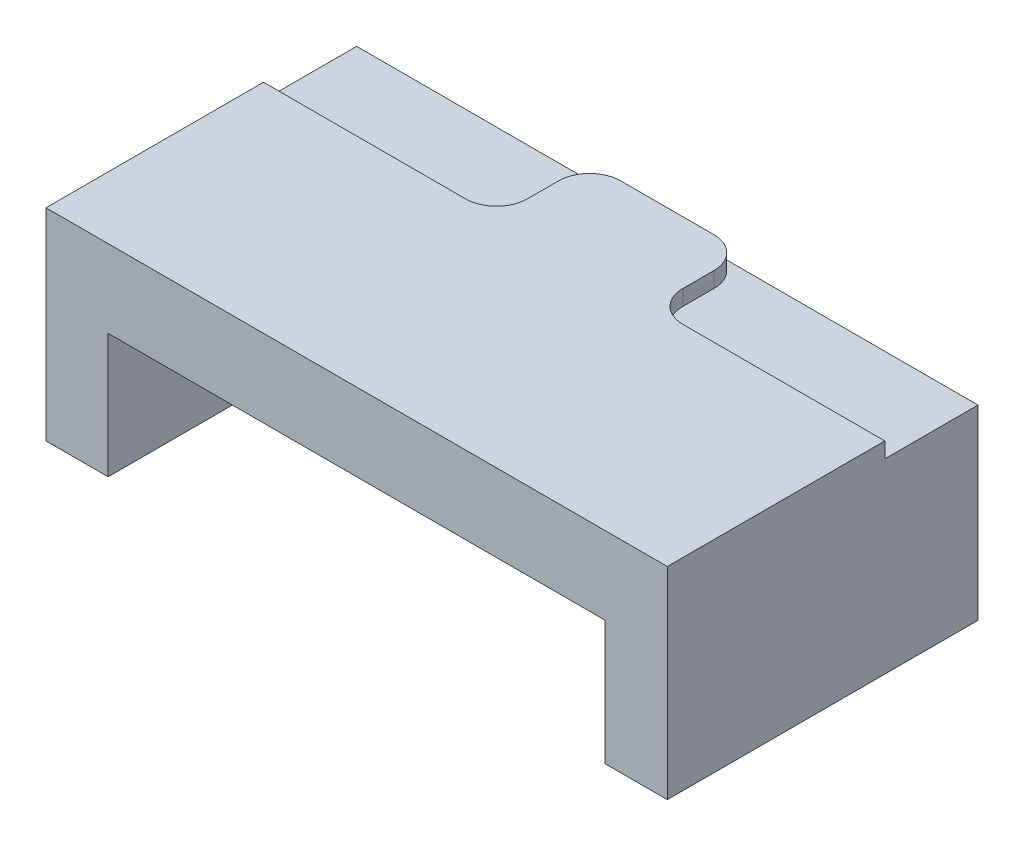
ISO-10303-21;
HEADER;
FILE_DESCRIPTION(('STEP AP214'),'2;1');
FILE_NAME('part.step','',(''),(''),'','','');
FILE_SCHEMA(('AUTOMOTIVE_DESIGN { 1 0 10303 214 1 1 1 1 }'));
ENDSEC;
DATA;
#1=APPLICATION_CONTEXT('core data for automotive mechanical design processes');
#2=APPLICATION_PROTOCOL_DEFINITION('international standard','automotive_design',2000,#1);
#3=PRODUCT_CONTEXT('',#1,'mechanical');
#4=PRODUCT('Part','Part','',(#3));
#5=PRODUCT_RELATED_PRODUCT_CATEGORY('part','',(#4));
#6=PRODUCT_DEFINITION_FORMATION('','',#4);
#7=PRODUCT_DEFINITION_CONTEXT('part definition',#1,'design');
#8=PRODUCT_DEFINITION('design','',#6,#7);
#9=PRODUCT_DEFINITION_SHAPE('','',#8);
#10=(LENGTH_UNIT() NAMED_UNIT(*) SI_UNIT(.MILLI.,.METRE.));
#11=(NAMED_UNIT(*) PLANE_ANGLE_UNIT() SI_UNIT($,.RADIAN.));
#12=(NAMED_UNIT(*) SI_UNIT($,.STERADIAN.) SOLID_ANGLE_UNIT());
#13=UNCERTAINTY_MEASURE_WITH_UNIT(LENGTH_MEASURE(1.E-05),#10,'distance_accuracy_value','');
#14=(GEOMETRIC_REPRESENTATION_CONTEXT(3) GLOBAL_UNCERTAINTY_ASSIGNED_CONTEXT((#13)) GLOBAL_UNIT_ASSIGNED_CONTEXT((#10,
#11,#12)) REPRESENTATION_CONTEXT('',''));
#15=CARTESIAN_POINT('',(0.,0.,0.));
#16=DIRECTION('',(0.,0.,1.));
#17=DIRECTION('',(1.,0.,0.));
#18=AXIS2_PLACEMENT_3D('',#15,#16,#17);
#19=CARTESIAN_POINT('',(0.,204.088235294118,538.804997387774));
#20=DIRECTION('',(0.,-1.,0.));
#21=DIRECTION('',(1.,0.,0.));
#22=AXIS2_PLACEMENT_3D('',#19,#20,#21);
#23=PLANE('',#22);
#24=DIRECTION('',(1.,0.,0.));
#25=VECTOR('',#24,1.);
#26=CARTESIAN_POINT('',(0.,204.088235294118,-161.195002612226));
#27=LINE('',#26,#25);
#28=CARTESIAN_POINT('',(-1000.,204.088235294118,-161.195002612226));
#29=VERTEX_POINT('',#28);
#30=CARTESIAN_POINT('',(-350.,204.088235294118,-161.195002612226));
#31=VERTEX_POINT('',#30);
#32=EDGE_CURVE('E186',#29,#31,#27,.T.);
#33=ORIENTED_EDGE('',*,*,#32,.T.);
#34=CARTESIAN_POINT('',(-350.,204.088235294118,-261.195002612226));
#35=DIRECTION('',(0.,-1.,0.));
#36=DIRECTION('',(1.,0.,0.));
#37=AXIS2_PLACEMENT_3D('',#34,#35,#36);
#38=CIRCLE('',#37,100.);
#39=CARTESIAN_POINT('',(-250.,204.088235294118,-261.195002612226));
#40=VERTEX_POINT('',#39);
#41=EDGE_CURVE('E328',#31,#40,#38,.F.);
#42=ORIENTED_EDGE('',*,*,#41,.T.);
#43=DIRECTION('',(0.,0.,1.));
#44=VECTOR('',#43,1.);
#45=CARTESIAN_POINT('',(-250.,204.088235294118,-461.195002612226));
#46=LINE('',#45,#44);
#47=CARTESIAN_POINT('',(-250.,204.088235294118,-361.195002612226));
#48=VERTEX_POINT('',#47);
#49=EDGE_CURVE('E210',#48,#40,#46,.T.);
#50=ORIENTED_EDGE('',*,*,#49,.F.);
#51=CARTESIAN_POINT('',(-150.,204.088235294118,-361.195002612226));
#52=DIRECTION('',(0.,-1.,0.));
#53=DIRECTION('',(1.,0.,0.));
#54=AXIS2_PLACEMENT_3D('',#51,#52,#53);
#55=CIRCLE('',#54,100.);
#56=CARTESIAN_POINT('',(-150.,204.088235294118,-461.195002612226));
#57=VERTEX_POINT('',#56);
#58=EDGE_CURVE('E364',#48,#57,#55,.T.);
#59=ORIENTED_EDGE('',*,*,#58,.T.);
#60=DIRECTION('',(-1.,0.,0.));
#61=VECTOR('',#60,1.);
#62=CARTESIAN_POINT('',(0.,204.088235294118,-461.195002612226));
#63=LINE('',#62,#61);
#64=CARTESIAN_POINT('',(-1000.,204.088235294117,-461.195002612226));
#65=VERTEX_POINT('',#64);
#66=EDGE_CURVE('E283',#57,#65,#63,.T.);
#67=ORIENTED_EDGE('',*,*,#66,.T.);
#68=DIRECTION('',(0.,0.,-1.));
#69=VECTOR('',#68,1.);
#70=CARTESIAN_POINT('',(-1000.,204.088235294117,538.804997387774));
#71=LINE('',#70,#69);
#72=EDGE_CURVE('E322',#29,#65,#71,.T.);
#73=ORIENTED_EDGE('',*,*,#72,.F.);
#74=EDGE_LOOP('',(#33,#42,#50,#59,#67,#73));
#75=FACE_BOUND('',#74,.T.);
#76=ADVANCED_FACE('F53',(#75),#23,.F.);
#77=DIRECTION('',(0.,0.,1.));
#78=VECTOR('',#77,1.);
#79=CARTESIAN_POINT('',(250.,204.088235294118,-461.195002612226));
#80=LINE('',#79,#78);
#81=CARTESIAN_POINT('',(250.,204.088235294118,-361.195002612226));
#82=VERTEX_POINT('',#81);
#83=CARTESIAN_POINT('',(250.,204.088235294118,-261.195002612226));
#84=VERTEX_POINT('',#83);
#85=EDGE_CURVE('E215',#82,#84,#80,.T.);
#86=ORIENTED_EDGE('',*,*,#85,.T.);
#87=CARTESIAN_POINT('',(350.,204.088235294118,-261.195002612226));
#88=DIRECTION('',(0.,-1.,0.));
#89=DIRECTION('',(1.,0.,0.));
#90=AXIS2_PLACEMENT_3D('',#87,#88,#89);
#91=CIRCLE('',#90,100.);
#92=CARTESIAN_POINT('',(350.,204.088235294118,-161.195002612226));
#93=VERTEX_POINT('',#92);
#94=EDGE_CURVE('E69',#84,#93,#91,.F.);
#95=ORIENTED_EDGE('',*,*,#94,.T.);
#96=CARTESIAN_POINT('',(1000.,204.088235294117,-161.195002612226));
#97=VERTEX_POINT('',#96);
#98=EDGE_CURVE('E242',#93,#97,#27,.T.);
#99=ORIENTED_EDGE('',*,*,#98,.T.);
#100=DIRECTION('',(0.,0.,-1.));
#101=VECTOR('',#100,1.);
#102=CARTESIAN_POINT('',(1000.,204.088235294117,538.804997387774));
#103=LINE('',#102,#101);
#104=CARTESIAN_POINT('',(1000.,204.088235294117,-461.195002612226));
#105=VERTEX_POINT('',#104);
#106=EDGE_CURVE('E260',#97,#105,#103,.T.);
#107=ORIENTED_EDGE('',*,*,#106,.T.);
#108=CARTESIAN_POINT('',(150.,204.088235294118,-461.195002612226));
#109=VERTEX_POINT('',#108);
#110=EDGE_CURVE('E297',#105,#109,#63,.T.);
#111=ORIENTED_EDGE('',*,*,#110,.T.);
#112=CARTESIAN_POINT('',(150.,204.088235294118,-361.195002612226));
#113=DIRECTION('',(0.,-1.,0.));
#114=DIRECTION('',(1.,0.,0.));
#115=AXIS2_PLACEMENT_3D('',#112,#113,#114);
#116=CIRCLE('',#115,100.);
#117=EDGE_CURVE('E62',#109,#82,#116,.T.);
#118=ORIENTED_EDGE('',*,*,#117,.T.);
#119=EDGE_LOOP('',(#86,#95,#99,#107,#111,#118));
#120=FACE_BOUND('',#119,.T.);
#121=ADVANCED_FACE('F370',(#120),#23,.F.);
#122=CARTESIAN_POINT('',(-1000.,204.088235294117,538.804997387774));
#123=DIRECTION('',(1.,0.,0.));
#124=DIRECTION('',(0.,1.,0.));
#125=AXIS2_PLACEMENT_3D('',#122,#123,#124);
#126=PLANE('',#125);
#127=DIRECTION('',(0.,-1.,0.));
#128=VECTOR('',#127,1.);
#129=CARTESIAN_POINT('',(-1000.,204.088235294117,-461.195002612226));
#130=LINE('',#129,#128);
#131=CARTESIAN_POINT('',(-1000.,-395.911764705882,-461.195002612226));
#132=VERTEX_POINT('',#131);
#133=EDGE_CURVE('E300',#65,#132,#130,.T.);
#134=ORIENTED_EDGE('',*,*,#133,.T.);
#135=DIRECTION('',(0.,0.,-1.));
#136=VECTOR('',#135,1.);
#137=CARTESIAN_POINT('',(-1000.,-395.911764705882,538.804997387774));
#138=LINE('',#137,#136);
#139=CARTESIAN_POINT('',(-1000.,-395.911764705882,538.804997387774));
#140=VERTEX_POINT('',#139);
#141=EDGE_CURVE('E318',#140,#132,#138,.T.);
#142=ORIENTED_EDGE('',*,*,#141,.F.);
#143=DIRECTION('',(0.,-1.,0.));
#144=VECTOR('',#143,1.);
#145=CARTESIAN_POINT('',(-1000.,204.088235294117,538.804997387774));
#146=LINE('',#145,#144);
#147=CARTESIAN_POINT('',(-1000.,254.088235294118,538.804997387774));
#148=VERTEX_POINT('',#147);
#149=EDGE_CURVE('E197',#148,#140,#146,.T.);
#150=ORIENTED_EDGE('',*,*,#149,.F.);
#151=DIRECTION('',(0.,0.,1.));
#152=VECTOR('',#151,1.);
#153=CARTESIAN_POINT('',(-1000.,254.088235294118,-461.195002612226));
#154=LINE('',#153,#152);
#155=CARTESIAN_POINT('',(-1000.,254.088235294118,-161.195002612226));
#156=VERTEX_POINT('',#155);
#157=EDGE_CURVE('E194',#156,#148,#154,.T.);
#158=ORIENTED_EDGE('',*,*,#157,.F.);
#159=DIRECTION('',(0.,-1.,0.));
#160=VECTOR('',#159,1.);
#161=CARTESIAN_POINT('',(-1000.,254.088235294118,-161.195002612226));
#162=LINE('',#161,#160);
#163=EDGE_CURVE('E178',#156,#29,#162,.T.);
#164=ORIENTED_EDGE('',*,*,#163,.T.);
#165=ORIENTED_EDGE('',*,*,#72,.T.);
#166=EDGE_LOOP('',(#134,#142,#150,#158,#164,#165));
#167=FACE_BOUND('',#166,.T.);
#168=ADVANCED_FACE('F195',(#167),#126,.F.);
#169=CARTESIAN_POINT('',(-1000.,-395.911764705882,538.804997387774));
#170=DIRECTION('',(0.,1.,0.));
#171=DIRECTION('',(-1.,0.,0.));
#172=AXIS2_PLACEMENT_3D('',#169,#170,#171);
#173=PLANE('',#172);
#174=DIRECTION('',(1.,0.,0.));
#175=VECTOR('',#174,1.);
#176=CARTESIAN_POINT('',(-1000.,-395.911764705882,-461.195002612226));
#177=LINE('',#176,#175);
#178=CARTESIAN_POINT('',(-800.,-395.911764705882,-461.195002612226));
#179=VERTEX_POINT('',#178);
#180=EDGE_CURVE('E303',#132,#179,#177,.T.);
#181=ORIENTED_EDGE('',*,*,#180,.T.);
#182=DIRECTION('',(0.,0.,-1.));
#183=VECTOR('',#182,1.);
#184=CARTESIAN_POINT('',(-800.,-395.911764705882,538.804997387774));
#185=LINE('',#184,#183);
#186=CARTESIAN_POINT('',(-800.,-395.911764705882,538.804997387774));
#187=VERTEX_POINT('',#186);
#188=EDGE_CURVE('E314',#187,#179,#185,.T.);
#189=ORIENTED_EDGE('',*,*,#188,.F.);
#190=DIRECTION('',(1.,0.,0.));
#191=VECTOR('',#190,1.);
#192=CARTESIAN_POINT('',(-1000.,-395.911764705882,538.804997387774));
#193=LINE('',#192,#191);
#194=EDGE_CURVE('E286',#140,#187,#193,.T.);
#195=ORIENTED_EDGE('',*,*,#194,.F.);
#196=ORIENTED_EDGE('',*,*,#141,.T.);
#197=EDGE_LOOP('',(#181,#189,#195,#196));
#198=FACE_BOUND('',#197,.T.);
#199=ADVANCED_FACE('F401',(#198),#173,.F.);
#200=CARTESIAN_POINT('',(-800.,-395.911764705882,538.804997387774));
#201=DIRECTION('',(-1.,0.,0.));
#202=DIRECTION('',(0.,0.,1.));
#203=AXIS2_PLACEMENT_3D('',#200,#201,#202);
#204=PLANE('',#203);
#205=DIRECTION('',(0.,1.,0.));
#206=VECTOR('',#205,1.);
#207=CARTESIAN_POINT('',(-800.,-395.911764705882,-461.195002612226));
#208=LINE('',#207,#206);
#209=CARTESIAN_POINT('',(-800.,4.08823529411739,-461.195002612226));
#210=VERTEX_POINT('',#209);
#211=EDGE_CURVE('E306',#179,#210,#208,.T.);
#212=ORIENTED_EDGE('',*,*,#211,.T.);
#213=DIRECTION('',(0.,0.,-1.));
#214=VECTOR('',#213,1.);
#215=CARTESIAN_POINT('',(-800.,4.08823529411739,538.804997387774));
#216=LINE('',#215,#214);
#217=CARTESIAN_POINT('',(-800.,4.08823529411739,538.804997387774));
#218=VERTEX_POINT('',#217);
#219=EDGE_CURVE('E296',#218,#210,#216,.T.);
#220=ORIENTED_EDGE('',*,*,#219,.F.);
#221=DIRECTION('',(0.,1.,0.));
#222=VECTOR('',#221,1.);
#223=CARTESIAN_POINT('',(-800.,-395.911764705882,538.804997387774));
#224=LINE('',#223,#222);
#225=EDGE_CURVE('E290',#187,#218,#224,.T.);
#226=ORIENTED_EDGE('',*,*,#225,.F.);
#227=ORIENTED_EDGE('',*,*,#188,.T.);
#228=EDGE_LOOP('',(#212,#220,#226,#227));
#229=FACE_BOUND('',#228,.T.);
#230=ADVANCED_FACE('F407',(#229),#204,.F.);
#231=CARTESIAN_POINT('',(-800.,4.08823529411739,538.804997387774));
#232=DIRECTION('',(0.,1.,0.));
#233=DIRECTION('',(0.,0.,1.));
#234=AXIS2_PLACEMENT_3D('',#231,#232,#233);
#235=PLANE('',#234);
#236=DIRECTION('',(1.,0.,0.));
#237=VECTOR('',#236,1.);
#238=CARTESIAN_POINT('',(-800.,4.08823529411739,-461.195002612226));
#239=LINE('',#238,#237);
#240=CARTESIAN_POINT('',(800.,4.08823529411739,-461.195002612226));
#241=VERTEX_POINT('',#240);
#242=EDGE_CURVE('E287',#210,#241,#239,.T.);
#243=ORIENTED_EDGE('',*,*,#242,.T.);
#244=DIRECTION('',(0.,0.,-1.));
#245=VECTOR('',#244,1.);
#246=CARTESIAN_POINT('',(800.,4.08823529411739,538.804997387774));
#247=LINE('',#246,#245);
#248=CARTESIAN_POINT('',(800.,4.08823529411739,538.804997387774));
#249=VERTEX_POINT('',#248);
#250=EDGE_CURVE('E279',#249,#241,#247,.T.);
#251=ORIENTED_EDGE('',*,*,#250,.F.);
#252=DIRECTION('',(1.,0.,0.));
#253=VECTOR('',#252,1.);
#254=CARTESIAN_POINT('',(-800.,4.08823529411739,538.804997387774));
#255=LINE('',#254,#253);
#256=EDGE_CURVE('E293',#218,#249,#255,.T.);
#257=ORIENTED_EDGE('',*,*,#256,.F.);
#258=ORIENTED_EDGE('',*,*,#219,.T.);
#259=EDGE_LOOP('',(#243,#251,#257,#258));
#260=FACE_BOUND('',#259,.T.);
#261=ADVANCED_FACE('F411',(#260),#235,.F.);
#262=CARTESIAN_POINT('',(0.,-395.911764705882,538.804997387774));
#263=DIRECTION('',(0.,0.,1.));
#264=DIRECTION('',(1.,0.,0.));
#265=AXIS2_PLACEMENT_3D('',#262,#263,#264);
#266=PLANE('',#265);
#267=ORIENTED_EDGE('',*,*,#256,.T.);
#268=DIRECTION('',(0.,1.,0.));
#269=VECTOR('',#268,1.);
#270=CARTESIAN_POINT('',(800.,-395.911764705882,538.804997387774));
#271=LINE('',#270,#269);
#272=CARTESIAN_POINT('',(800.,-395.911764705882,538.804997387774));
#273=VERTEX_POINT('',#272);
#274=EDGE_CURVE('E247',#273,#249,#271,.T.);
#275=ORIENTED_EDGE('',*,*,#274,.F.);
#276=DIRECTION('',(-1.,0.,0.));
#277=VECTOR('',#276,1.);
#278=CARTESIAN_POINT('',(1000.,-395.911764705882,538.804997387774));
#279=LINE('',#278,#277);
#280=CARTESIAN_POINT('',(1000.,-395.911764705882,538.804997387774));
#281=VERTEX_POINT('',#280);
#282=EDGE_CURVE('E251',#281,#273,#279,.T.);
#283=ORIENTED_EDGE('',*,*,#282,.F.);
#284=DIRECTION('',(0.,-1.,0.));
#285=VECTOR('',#284,1.);
#286=CARTESIAN_POINT('',(1000.,204.088235294117,538.804997387774));
#287=LINE('',#286,#285);
#288=CARTESIAN_POINT('',(1000.,254.088235294118,538.804997387774));
#289=VERTEX_POINT('',#288);
#290=EDGE_CURVE('E256',#289,#281,#287,.T.);
#291=ORIENTED_EDGE('',*,*,#290,.F.);
#292=DIRECTION('',(1.,0.,0.));
#293=VECTOR('',#292,1.);
#294=CARTESIAN_POINT('',(0.,254.088235294118,538.804997387774));
#295=LINE('',#294,#293);
#296=EDGE_CURVE('E202',#148,#289,#295,.T.);
#297=ORIENTED_EDGE('',*,*,#296,.F.);
#298=ORIENTED_EDGE('',*,*,#149,.T.);
#299=ORIENTED_EDGE('',*,*,#194,.T.);
#300=ORIENTED_EDGE('',*,*,#225,.T.);
#301=EDGE_LOOP('',(#267,#275,#283,#291,#297,#298,#299,#300));
#302=FACE_BOUND('',#301,.T.);
#303=ADVANCED_FACE('F415',(#302),#266,.T.);
#304=CARTESIAN_POINT('',(0.,-395.911764705882,-461.195002612226));
#305=DIRECTION('',(0.,0.,1.));
#306=DIRECTION('',(1.,0.,0.));
#307=AXIS2_PLACEMENT_3D('',#304,#305,#306);
#308=PLANE('',#307);
#309=ORIENTED_EDGE('',*,*,#66,.F.);
#310=DIRECTION('',(0.,-1.,0.));
#311=VECTOR('',#310,1.);
#312=CARTESIAN_POINT('',(-150.,-395.911764705882,-461.195002612226));
#313=LINE('',#312,#311);
#314=CARTESIAN_POINT('',(-150.,254.088235294118,-461.195002612226));
#315=VERTEX_POINT('',#314);
#316=EDGE_CURVE('E342',#57,#315,#313,.F.);
#317=ORIENTED_EDGE('',*,*,#316,.T.);
#318=DIRECTION('',(-1.,0.,0.));
#319=VECTOR('',#318,1.);
#320=CARTESIAN_POINT('',(0.,254.088235294118,-461.195002612226));
#321=LINE('',#320,#319);
#322=CARTESIAN_POINT('',(150.,254.088235294118,-461.195002612226));
#323=VERTEX_POINT('',#322);
#324=EDGE_CURVE('E227',#323,#315,#321,.T.);
#325=ORIENTED_EDGE('',*,*,#324,.F.);
#326=DIRECTION('',(0.,-1.,0.));
#327=VECTOR('',#326,1.);
#328=CARTESIAN_POINT('',(150.,204.088235294118,-461.195002612226));
#329=LINE('',#328,#327);
#330=EDGE_CURVE('E338',#323,#109,#329,.T.);
#331=ORIENTED_EDGE('',*,*,#330,.T.);
#332=ORIENTED_EDGE('',*,*,#110,.F.);
#333=DIRECTION('',(0.,-1.,0.));
#334=VECTOR('',#333,1.);
#335=CARTESIAN_POINT('',(1000.,204.088235294117,-461.195002612226));
#336=LINE('',#335,#334);
#337=CARTESIAN_POINT('',(1000.,-395.911764705882,-461.195002612226));
#338=VERTEX_POINT('',#337);
#339=EDGE_CURVE('E252',#105,#338,#336,.T.);
#340=ORIENTED_EDGE('',*,*,#339,.T.);
#341=DIRECTION('',(-1.,0.,0.));
#342=VECTOR('',#341,1.);
#343=CARTESIAN_POINT('',(1000.,-395.911764705882,-461.195002612226));
#344=LINE('',#343,#342);
#345=CARTESIAN_POINT('',(800.,-395.911764705882,-461.195002612226));
#346=VERTEX_POINT('',#345);
#347=EDGE_CURVE('E264',#338,#346,#344,.T.);
#348=ORIENTED_EDGE('',*,*,#347,.T.);
#349=DIRECTION('',(0.,1.,0.));
#350=VECTOR('',#349,1.);
#351=CARTESIAN_POINT('',(800.,-395.911764705882,-461.195002612226));
#352=LINE('',#351,#350);
#353=EDGE_CURVE('E190',#346,#241,#352,.T.);
#354=ORIENTED_EDGE('',*,*,#353,.T.);
#355=ORIENTED_EDGE('',*,*,#242,.F.);
#356=ORIENTED_EDGE('',*,*,#211,.F.);
#357=ORIENTED_EDGE('',*,*,#180,.F.);
#358=ORIENTED_EDGE('',*,*,#133,.F.);
#359=EDGE_LOOP('',(#309,#317,#325,#331,#332,#340,#348,#354,#355,#356,#357,#358));
#360=FACE_BOUND('',#359,.T.);
#361=ADVANCED_FACE('F383',(#360),#308,.F.);
#362=CARTESIAN_POINT('',(800.,-395.911764705882,538.804997387774));
#363=DIRECTION('',(-1.,0.,0.));
#364=DIRECTION('',(0.,0.,1.));
#365=AXIS2_PLACEMENT_3D('',#362,#363,#364);
#366=PLANE('',#365);
#367=ORIENTED_EDGE('',*,*,#353,.F.);
#368=DIRECTION('',(0.,0.,-1.));
#369=VECTOR('',#368,1.);
#370=CARTESIAN_POINT('',(800.,-395.911764705882,538.804997387774));
#371=LINE('',#370,#369);
#372=EDGE_CURVE('E276',#273,#346,#371,.T.);
#373=ORIENTED_EDGE('',*,*,#372,.F.);
#374=ORIENTED_EDGE('',*,*,#274,.T.);
#375=ORIENTED_EDGE('',*,*,#250,.T.);
#376=EDGE_LOOP('',(#367,#373,#374,#375));
#377=FACE_BOUND('',#376,.T.);
#378=ADVANCED_FACE('F540',(#377),#366,.T.);
#379=CARTESIAN_POINT('',(1000.,-395.911764705882,538.804997387774));
#380=DIRECTION('',(0.,-1.,0.));
#381=DIRECTION('',(1.,0.,0.));
#382=AXIS2_PLACEMENT_3D('',#379,#380,#381);
#383=PLANE('',#382);
#384=ORIENTED_EDGE('',*,*,#347,.F.);
#385=DIRECTION('',(0.,0.,-1.));
#386=VECTOR('',#385,1.);
#387=CARTESIAN_POINT('',(1000.,-395.911764705882,538.804997387774));
#388=LINE('',#387,#386);
#389=EDGE_CURVE('E273',#281,#338,#388,.T.);
#390=ORIENTED_EDGE('',*,*,#389,.F.);
#391=ORIENTED_EDGE('',*,*,#282,.T.);
#392=ORIENTED_EDGE('',*,*,#372,.T.);
#393=EDGE_LOOP('',(#384,#390,#391,#392));
#394=FACE_BOUND('',#393,.T.);
#395=ADVANCED_FACE('F532',(#394),#383,.T.);
#396=CARTESIAN_POINT('',(1000.,204.088235294117,538.804997387774));
#397=DIRECTION('',(1.,0.,0.));
#398=DIRECTION('',(0.,1.,0.));
#399=AXIS2_PLACEMENT_3D('',#396,#397,#398);
#400=PLANE('',#399);
#401=ORIENTED_EDGE('',*,*,#339,.F.);
#402=ORIENTED_EDGE('',*,*,#106,.F.);
#403=DIRECTION('',(0.,-1.,0.));
#404=VECTOR('',#403,1.);
#405=CARTESIAN_POINT('',(1000.,254.088235294118,-161.195002612226));
#406=LINE('',#405,#404);
#407=CARTESIAN_POINT('',(1000.,254.088235294118,-161.195002612226));
#408=VERTEX_POINT('',#407);
#409=EDGE_CURVE('E191',#408,#97,#406,.T.);
#410=ORIENTED_EDGE('',*,*,#409,.F.);
#411=DIRECTION('',(0.,0.,-1.));
#412=VECTOR('',#411,1.);
#413=CARTESIAN_POINT('',(1000.,254.088235294118,-461.195002612226));
#414=LINE('',#413,#412);
#415=EDGE_CURVE('E219',#289,#408,#414,.T.);
#416=ORIENTED_EDGE('',*,*,#415,.F.);
#417=ORIENTED_EDGE('',*,*,#290,.T.);
#418=ORIENTED_EDGE('',*,*,#389,.T.);
#419=EDGE_LOOP('',(#401,#402,#410,#416,#417,#418));
#420=FACE_BOUND('',#419,.T.);
#421=ADVANCED_FACE('F419',(#420),#400,.T.);
#422=CARTESIAN_POINT('',(0.,254.088235294118,-161.195002612226));
#423=DIRECTION('',(0.,0.,-1.));
#424=DIRECTION('',(-1.,0.,0.));
#425=AXIS2_PLACEMENT_3D('',#422,#423,#424);
#426=PLANE('',#425);
#427=DIRECTION('',(1.,0.,0.));
#428=VECTOR('',#427,1.);
#429=CARTESIAN_POINT('',(0.,254.088235294118,-161.195002612226));
#430=LINE('',#429,#428);
#431=CARTESIAN_POINT('',(-350.,254.088235294118,-161.195002612226));
#432=VERTEX_POINT('',#431);
#433=EDGE_CURVE('E183',#156,#432,#430,.T.);
#434=ORIENTED_EDGE('',*,*,#433,.T.);
#435=DIRECTION('',(0.,-1.,0.));
#436=VECTOR('',#435,1.);
#437=CARTESIAN_POINT('',(-350.,254.088235294118,-161.195002612226));
#438=LINE('',#437,#436);
#439=EDGE_CURVE('E325',#432,#31,#438,.T.);
#440=ORIENTED_EDGE('',*,*,#439,.T.);
#441=ORIENTED_EDGE('',*,*,#32,.F.);
#442=ORIENTED_EDGE('',*,*,#163,.F.);
#443=EDGE_LOOP('',(#434,#440,#441,#442));
#444=FACE_BOUND('',#443,.T.);
#445=ADVANCED_FACE('F180',(#444),#426,.T.);
#446=ORIENTED_EDGE('',*,*,#98,.F.);
#447=DIRECTION('',(0.,-1.,0.));
#448=VECTOR('',#447,1.);
#449=CARTESIAN_POINT('',(350.,254.088235294118,-161.195002612226));
#450=LINE('',#449,#448);
#451=CARTESIAN_POINT('',(350.,254.088235294118,-161.195002612226));
#452=VERTEX_POINT('',#451);
#453=EDGE_CURVE('E359',#93,#452,#450,.F.);
#454=ORIENTED_EDGE('',*,*,#453,.T.);
#455=EDGE_CURVE('E212',#452,#408,#430,.T.);
#456=ORIENTED_EDGE('',*,*,#455,.T.);
#457=ORIENTED_EDGE('',*,*,#409,.T.);
#458=EDGE_LOOP('',(#446,#454,#456,#457));
#459=FACE_BOUND('',#458,.T.);
#460=ADVANCED_FACE('F421',(#459),#426,.T.);
#461=CARTESIAN_POINT('',(250.,254.088235294118,-461.195002612226));
#462=DIRECTION('',(1.,0.,0.));
#463=DIRECTION('',(0.,0.,-1.));
#464=AXIS2_PLACEMENT_3D('',#461,#462,#463);
#465=PLANE('',#464);
#466=ORIENTED_EDGE('',*,*,#85,.F.);
#467=DIRECTION('',(0.,-1.,0.));
#468=VECTOR('',#467,1.);
#469=CARTESIAN_POINT('',(250.,254.088235294118,-361.195002612226));
#470=LINE('',#469,#468);
#471=CARTESIAN_POINT('',(250.,254.088235294118,-361.195002612226));
#472=VERTEX_POINT('',#471);
#473=EDGE_CURVE('E354',#82,#472,#470,.F.);
#474=ORIENTED_EDGE('',*,*,#473,.T.);
#475=DIRECTION('',(0.,0.,1.));
#476=VECTOR('',#475,1.);
#477=CARTESIAN_POINT('',(250.,254.088235294118,-461.195002612226));
#478=LINE('',#477,#476);
#479=CARTESIAN_POINT('',(250.,254.088235294118,-261.195002612226));
#480=VERTEX_POINT('',#479);
#481=EDGE_CURVE('E218',#472,#480,#478,.T.);
#482=ORIENTED_EDGE('',*,*,#481,.T.);
#483=DIRECTION('',(0.,-1.,0.));
#484=VECTOR('',#483,1.);
#485=CARTESIAN_POINT('',(250.,204.088235294118,-261.195002612226));
#486=LINE('',#485,#484);
#487=EDGE_CURVE('E351',#480,#84,#486,.T.);
#488=ORIENTED_EDGE('',*,*,#487,.T.);
#489=EDGE_LOOP('',(#466,#474,#482,#488));
#490=FACE_BOUND('',#489,.T.);
#491=ADVANCED_FACE('F376',(#490),#465,.T.);
#492=CARTESIAN_POINT('',(-250.,254.088235294118,-461.195002612226));
#493=DIRECTION('',(1.,0.,0.));
#494=DIRECTION('',(0.,0.,-1.));
#495=AXIS2_PLACEMENT_3D('',#492,#493,#494);
#496=PLANE('',#495);
#497=ORIENTED_EDGE('',*,*,#49,.T.);
#498=DIRECTION('',(0.,-1.,0.));
#499=VECTOR('',#498,1.);
#500=CARTESIAN_POINT('',(-250.,254.088235294118,-261.195002612226));
#501=LINE('',#500,#499);
#502=CARTESIAN_POINT('',(-250.,254.088235294118,-261.195002612226));
#503=VERTEX_POINT('',#502);
#504=EDGE_CURVE('E335',#40,#503,#501,.F.);
#505=ORIENTED_EDGE('',*,*,#504,.T.);
#506=DIRECTION('',(0.,0.,1.));
#507=VECTOR('',#506,1.);
#508=CARTESIAN_POINT('',(-250.,254.088235294118,-461.195002612226));
#509=LINE('',#508,#507);
#510=CARTESIAN_POINT('',(-250.,254.088235294118,-361.195002612226));
#511=VERTEX_POINT('',#510);
#512=EDGE_CURVE('E237',#511,#503,#509,.T.);
#513=ORIENTED_EDGE('',*,*,#512,.F.);
#514=DIRECTION('',(0.,-1.,0.));
#515=VECTOR('',#514,1.);
#516=CARTESIAN_POINT('',(-250.,254.088235294118,-361.195002612226));
#517=LINE('',#516,#515);
#518=EDGE_CURVE('E331',#511,#48,#517,.T.);
#519=ORIENTED_EDGE('',*,*,#518,.T.);
#520=EDGE_LOOP('',(#497,#505,#513,#519));
#521=FACE_BOUND('',#520,.T.);
#522=ADVANCED_FACE('F392',(#521),#496,.F.);
#523=CARTESIAN_POINT('',(0.,254.088235294118,-461.195002612226));
#524=DIRECTION('',(0.,1.,0.));
#525=DIRECTION('',(0.,0.,1.));
#526=AXIS2_PLACEMENT_3D('',#523,#524,#525);
#527=PLANE('',#526);
#528=ORIENTED_EDGE('',*,*,#324,.T.);
#529=CARTESIAN_POINT('',(-150.,254.088235294118,-361.195002612226));
#530=DIRECTION('',(0.,1.,0.));
#531=DIRECTION('',(0.,0.,1.));
#532=AXIS2_PLACEMENT_3D('',#529,#530,#531);
#533=CIRCLE('',#532,100.);
#534=EDGE_CURVE('E348',#315,#511,#533,.T.);
#535=ORIENTED_EDGE('',*,*,#534,.T.);
#536=ORIENTED_EDGE('',*,*,#512,.T.);
#537=CARTESIAN_POINT('',(-350.,254.088235294118,-261.195002612226));
#538=DIRECTION('',(0.,1.,0.));
#539=DIRECTION('',(0.,0.,1.));
#540=AXIS2_PLACEMENT_3D('',#537,#538,#539);
#541=CIRCLE('',#540,100.);
#542=EDGE_CURVE('E208',#503,#432,#541,.F.);
#543=ORIENTED_EDGE('',*,*,#542,.T.);
#544=ORIENTED_EDGE('',*,*,#433,.F.);
#545=ORIENTED_EDGE('',*,*,#157,.T.);
#546=ORIENTED_EDGE('',*,*,#296,.T.);
#547=ORIENTED_EDGE('',*,*,#415,.T.);
#548=ORIENTED_EDGE('',*,*,#455,.F.);
#549=CARTESIAN_POINT('',(350.,254.088235294118,-261.195002612226));
#550=DIRECTION('',(0.,1.,0.));
#551=DIRECTION('',(0.,0.,1.));
#552=AXIS2_PLACEMENT_3D('',#549,#550,#551);
#553=CIRCLE('',#552,100.);
#554=EDGE_CURVE('E11',#452,#480,#553,.F.);
#555=ORIENTED_EDGE('',*,*,#554,.T.);
#556=ORIENTED_EDGE('',*,*,#481,.F.);
#557=CARTESIAN_POINT('',(150.,254.088235294118,-361.195002612226));
#558=DIRECTION('',(0.,1.,0.));
#559=DIRECTION('',(0.,0.,1.));
#560=AXIS2_PLACEMENT_3D('',#557,#558,#559);
#561=CIRCLE('',#560,100.);
#562=EDGE_CURVE('E345',#472,#323,#561,.T.);
#563=ORIENTED_EDGE('',*,*,#562,.T.);
#564=EDGE_LOOP('',(#528,#535,#536,#543,#544,#545,#546,#547,#548,#555,#556,#563));
#565=FACE_BOUND('',#564,.T.);
#566=ADVANCED_FACE('F205',(#565),#527,.T.);
#567=CARTESIAN_POINT('',(-350.,254.088235294118,-261.195002612226));
#568=DIRECTION('',(0.,-1.,0.));
#569=DIRECTION('',(0.,0.,-1.));
#570=AXIS2_PLACEMENT_3D('',#567,#568,#569);
#571=CYLINDRICAL_SURFACE('',#570,100.);
#572=ORIENTED_EDGE('',*,*,#542,.F.);
#573=ORIENTED_EDGE('',*,*,#504,.F.);
#574=ORIENTED_EDGE('',*,*,#41,.F.);
#575=ORIENTED_EDGE('',*,*,#439,.F.);
#576=EDGE_LOOP('',(#572,#573,#574,#575));
#577=FACE_BOUND('',#576,.T.);
#578=ADVANCED_FACE('F396',(#577),#571,.F.);
#579=CARTESIAN_POINT('',(-150.,254.088235294118,-361.195002612226));
#580=DIRECTION('',(0.,-1.,0.));
#581=DIRECTION('',(0.,0.,-1.));
#582=AXIS2_PLACEMENT_3D('',#579,#580,#581);
#583=CYLINDRICAL_SURFACE('',#582,100.);
#584=ORIENTED_EDGE('',*,*,#534,.F.);
#585=ORIENTED_EDGE('',*,*,#316,.F.);
#586=ORIENTED_EDGE('',*,*,#58,.F.);
#587=ORIENTED_EDGE('',*,*,#518,.F.);
#588=EDGE_LOOP('',(#584,#585,#586,#587));
#589=FACE_BOUND('',#588,.T.);
#590=ADVANCED_FACE('F388',(#589),#583,.T.);
#591=CARTESIAN_POINT('',(150.,-395.911764705882,-361.195002612226));
#592=DIRECTION('',(0.,1.,0.));
#593=DIRECTION('',(0.,0.,1.));
#594=AXIS2_PLACEMENT_3D('',#591,#592,#593);
#595=CYLINDRICAL_SURFACE('',#594,100.);
#596=ORIENTED_EDGE('',*,*,#562,.F.);
#597=ORIENTED_EDGE('',*,*,#473,.F.);
#598=ORIENTED_EDGE('',*,*,#117,.F.);
#599=ORIENTED_EDGE('',*,*,#330,.F.);
#600=EDGE_LOOP('',(#596,#597,#598,#599));
#601=FACE_BOUND('',#600,.T.);
#602=ADVANCED_FACE('F379',(#601),#595,.T.);
#603=CARTESIAN_POINT('',(350.,254.088235294118,-261.195002612226));
#604=DIRECTION('',(0.,1.,0.));
#605=DIRECTION('',(0.,0.,1.));
#606=AXIS2_PLACEMENT_3D('',#603,#604,#605);
#607=CYLINDRICAL_SURFACE('',#606,100.);
#608=ORIENTED_EDGE('',*,*,#554,.F.);
#609=ORIENTED_EDGE('',*,*,#453,.F.);
#610=ORIENTED_EDGE('',*,*,#94,.F.);
#611=ORIENTED_EDGE('',*,*,#487,.F.);
#612=EDGE_LOOP('',(#608,#609,#610,#611));
#613=FACE_BOUND('',#612,.T.);
#614=ADVANCED_FACE('F55',(#613),#607,.F.);
#615=CLOSED_SHELL('',(#76,#121,#168,#199,#230,#261,#303,#361,#378,#395,#421,#445,#460,#491,#522,
#566,#578,#590,#602,#614));
#616=MANIFOLD_SOLID_BREP('B2',#615);
#617=ADVANCED_BREP_SHAPE_REPRESENTATION('',(#18,#616),#14);
#618=SHAPE_DEFINITION_REPRESENTATION(#9,#617);
ENDSEC;
END-ISO-10303-21;
